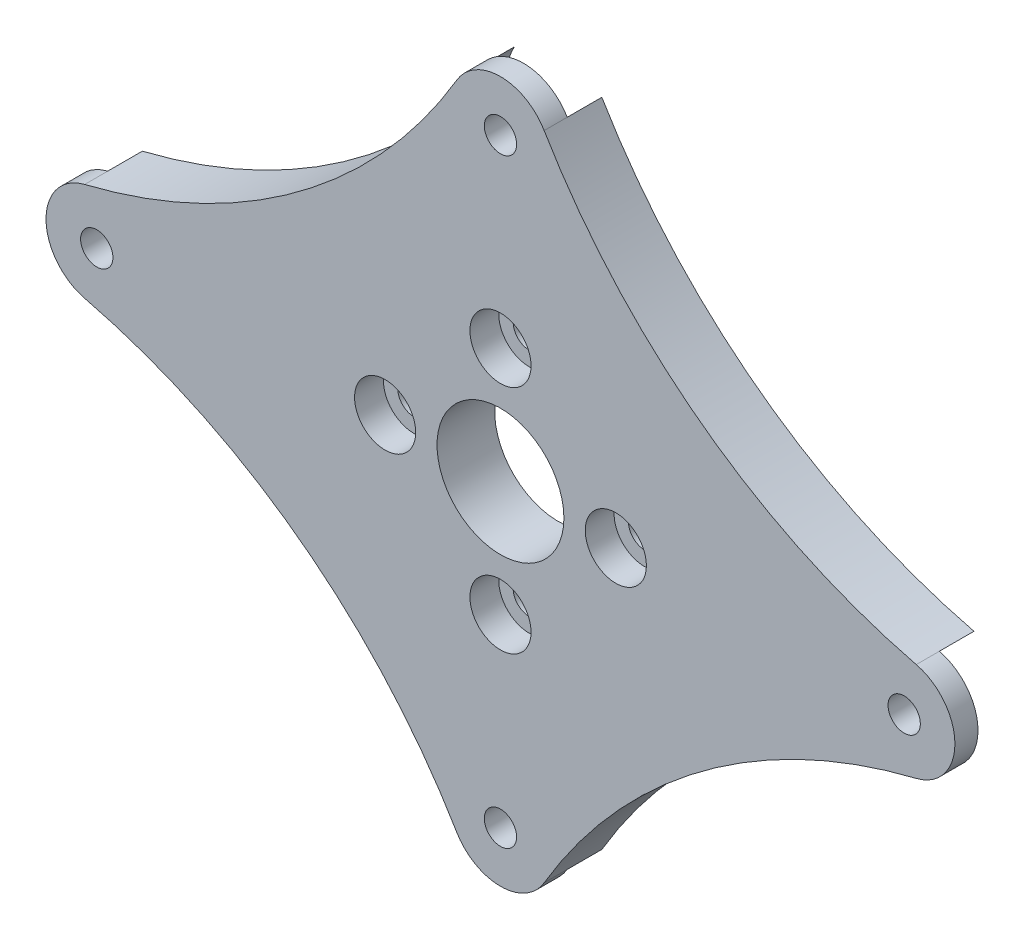
ISO-10303-21;
HEADER;
FILE_DESCRIPTION(('STEP AP214'),'2;1');
FILE_NAME('part.step','',(''),(''),'','','');
FILE_SCHEMA(('AUTOMOTIVE_DESIGN { 1 0 10303 214 1 1 1 1 }'));
ENDSEC;
DATA;
#1=APPLICATION_CONTEXT('core data for automotive mechanical design processes');
#2=APPLICATION_PROTOCOL_DEFINITION('international standard','automotive_design',2000,#1);
#3=PRODUCT_CONTEXT('',#1,'mechanical');
#4=PRODUCT('Part','Part','',(#3));
#5=PRODUCT_RELATED_PRODUCT_CATEGORY('part','',(#4));
#6=PRODUCT_DEFINITION_FORMATION('','',#4);
#7=PRODUCT_DEFINITION_CONTEXT('part definition',#1,'design');
#8=PRODUCT_DEFINITION('design','',#6,#7);
#9=PRODUCT_DEFINITION_SHAPE('','',#8);
#10=(LENGTH_UNIT() NAMED_UNIT(*) SI_UNIT(.MILLI.,.METRE.));
#11=(NAMED_UNIT(*) PLANE_ANGLE_UNIT() SI_UNIT($,.RADIAN.));
#12=(NAMED_UNIT(*) SI_UNIT($,.STERADIAN.) SOLID_ANGLE_UNIT());
#13=UNCERTAINTY_MEASURE_WITH_UNIT(LENGTH_MEASURE(1.E-05),#10,'distance_accuracy_value','');
#14=(GEOMETRIC_REPRESENTATION_CONTEXT(3) GLOBAL_UNCERTAINTY_ASSIGNED_CONTEXT((#13)) GLOBAL_UNIT_ASSIGNED_CONTEXT((#10,
#11,#12)) REPRESENTATION_CONTEXT('',''));
#15=CARTESIAN_POINT('',(0.,0.,0.));
#16=DIRECTION('',(0.,0.,1.));
#17=DIRECTION('',(1.,0.,0.));
#18=AXIS2_PLACEMENT_3D('',#15,#16,#17);
#19=CARTESIAN_POINT('',(-35.,0.,5.));
#20=DIRECTION('',(0.,0.,-1.));
#21=DIRECTION('',(-1.,0.,0.));
#22=AXIS2_PLACEMENT_3D('',#19,#20,#21);
#23=CYLINDRICAL_SURFACE('',#22,4.4);
#24=CARTESIAN_POINT('',(-35.,0.,3.));
#25=DIRECTION('',(0.,0.,-1.));
#26=DIRECTION('',(-1.,0.,0.));
#27=AXIS2_PLACEMENT_3D('',#24,#25,#26);
#28=CIRCLE('',#27,4.4);
#29=CARTESIAN_POINT('',(-36.0484540455452,-4.27325919110694,3.));
#30=VERTEX_POINT('',#29);
#31=CARTESIAN_POINT('',(-36.0484540455452,4.27325919110695,3.));
#32=VERTEX_POINT('',#31);
#33=EDGE_CURVE('E396',#30,#32,#28,.T.);
#34=ORIENTED_EDGE('',*,*,#33,.F.);
#35=DIRECTION('',(0.,0.,-1.));
#36=VECTOR('',#35,1.);
#37=CARTESIAN_POINT('',(-36.0484540455452,-4.27325919110694,5.));
#38=LINE('',#37,#36);
#39=CARTESIAN_POINT('',(-36.0484540455452,-4.27325919110694,5.));
#40=VERTEX_POINT('',#39);
#41=EDGE_CURVE('E55',#40,#30,#38,.T.);
#42=ORIENTED_EDGE('',*,*,#41,.F.);
#43=CARTESIAN_POINT('',(-35.,0.,5.));
#44=DIRECTION('',(0.,0.,1.));
#45=DIRECTION('',(-1.,0.,0.));
#46=AXIS2_PLACEMENT_3D('',#43,#44,#45);
#47=CIRCLE('',#46,4.4);
#48=CARTESIAN_POINT('',(-36.0484540455452,4.27325919110694,5.));
#49=VERTEX_POINT('',#48);
#50=EDGE_CURVE('E98',#49,#40,#47,.T.);
#51=ORIENTED_EDGE('',*,*,#50,.F.);
#52=DIRECTION('',(0.,0.,-1.));
#53=VECTOR('',#52,1.);
#54=CARTESIAN_POINT('',(-36.0484540455452,4.27325919110694,5.));
#55=LINE('',#54,#53);
#56=EDGE_CURVE('E11',#49,#32,#55,.T.);
#57=ORIENTED_EDGE('',*,*,#56,.T.);
#58=EDGE_LOOP('',(#34,#42,#51,#57));
#59=FACE_BOUND('',#58,.T.);
#60=ADVANCED_FACE('F45',(#59),#23,.T.);
#61=CARTESIAN_POINT('',(0.,-26.,5.));
#62=DIRECTION('',(0.,0.,-1.));
#63=DIRECTION('',(-1.,0.,0.));
#64=AXIS2_PLACEMENT_3D('',#61,#62,#63);
#65=CYLINDRICAL_SURFACE('',#64,4.4);
#66=CARTESIAN_POINT('',(0.,-26.,3.));
#67=DIRECTION('',(0.,0.,-1.));
#68=DIRECTION('',(-1.,0.,0.));
#69=AXIS2_PLACEMENT_3D('',#66,#67,#68);
#70=CIRCLE('',#69,4.4);
#71=CARTESIAN_POINT('',(3.78839056118376,-28.2378777794897,3.));
#72=VERTEX_POINT('',#71);
#73=CARTESIAN_POINT('',(-3.78839056118376,-28.2378777794897,3.));
#74=VERTEX_POINT('',#73);
#75=EDGE_CURVE('E330',#72,#74,#70,.T.);
#76=ORIENTED_EDGE('',*,*,#75,.F.);
#77=DIRECTION('',(0.,0.,-1.));
#78=VECTOR('',#77,1.);
#79=CARTESIAN_POINT('',(3.78839056118375,-28.2378777794897,5.));
#80=LINE('',#79,#78);
#81=CARTESIAN_POINT('',(3.78839056118375,-28.2378777794897,5.));
#82=VERTEX_POINT('',#81);
#83=EDGE_CURVE('E178',#82,#72,#80,.T.);
#84=ORIENTED_EDGE('',*,*,#83,.F.);
#85=CARTESIAN_POINT('',(0.,-26.,5.));
#86=DIRECTION('',(0.,0.,1.));
#87=DIRECTION('',(-1.,0.,0.));
#88=AXIS2_PLACEMENT_3D('',#85,#86,#87);
#89=CIRCLE('',#88,4.4);
#90=CARTESIAN_POINT('',(-3.78839056118377,-28.2378777794897,5.));
#91=VERTEX_POINT('',#90);
#92=EDGE_CURVE('E318',#91,#82,#89,.T.);
#93=ORIENTED_EDGE('',*,*,#92,.F.);
#94=DIRECTION('',(0.,0.,-1.));
#95=VECTOR('',#94,1.);
#96=CARTESIAN_POINT('',(-3.78839056118377,-28.2378777794897,5.));
#97=LINE('',#96,#95);
#98=EDGE_CURVE('E182',#91,#74,#97,.T.);
#99=ORIENTED_EDGE('',*,*,#98,.T.);
#100=EDGE_LOOP('',(#76,#84,#93,#99));
#101=FACE_BOUND('',#100,.T.);
#102=ADVANCED_FACE('F327',(#101),#65,.T.);
#103=CARTESIAN_POINT('',(35.,0.,5.));
#104=DIRECTION('',(0.,0.,-1.));
#105=DIRECTION('',(-1.,0.,0.));
#106=AXIS2_PLACEMENT_3D('',#103,#104,#105);
#107=CYLINDRICAL_SURFACE('',#106,4.4);
#108=CARTESIAN_POINT('',(35.,0.,3.));
#109=DIRECTION('',(0.,0.,-1.));
#110=DIRECTION('',(-1.,0.,0.));
#111=AXIS2_PLACEMENT_3D('',#108,#109,#110);
#112=CIRCLE('',#111,4.4);
#113=CARTESIAN_POINT('',(36.0484540455452,4.27325919110694,3.));
#114=VERTEX_POINT('',#113);
#115=CARTESIAN_POINT('',(36.0484540455452,-4.27325919110694,3.));
#116=VERTEX_POINT('',#115);
#117=EDGE_CURVE('E133',#114,#116,#112,.T.);
#118=ORIENTED_EDGE('',*,*,#117,.F.);
#119=DIRECTION('',(0.,0.,-1.));
#120=VECTOR('',#119,1.);
#121=CARTESIAN_POINT('',(36.0484540455452,4.27325919110693,5.));
#122=LINE('',#121,#120);
#123=CARTESIAN_POINT('',(36.0484540455452,4.27325919110693,5.));
#124=VERTEX_POINT('',#123);
#125=EDGE_CURVE('E129',#124,#114,#122,.T.);
#126=ORIENTED_EDGE('',*,*,#125,.F.);
#127=CARTESIAN_POINT('',(35.,0.,5.));
#128=DIRECTION('',(0.,0.,1.));
#129=DIRECTION('',(-1.,0.,0.));
#130=AXIS2_PLACEMENT_3D('',#127,#128,#129);
#131=CIRCLE('',#130,4.4);
#132=CARTESIAN_POINT('',(36.0484540455452,-4.27325919110694,5.));
#133=VERTEX_POINT('',#132);
#134=EDGE_CURVE('E113',#133,#124,#131,.T.);
#135=ORIENTED_EDGE('',*,*,#134,.F.);
#136=DIRECTION('',(0.,0.,-1.));
#137=VECTOR('',#136,1.);
#138=CARTESIAN_POINT('',(36.0484540455452,-4.27325919110694,5.));
#139=LINE('',#138,#137);
#140=EDGE_CURVE('E136',#133,#116,#139,.T.);
#141=ORIENTED_EDGE('',*,*,#140,.T.);
#142=EDGE_LOOP('',(#118,#126,#135,#141));
#143=FACE_BOUND('',#142,.T.);
#144=ADVANCED_FACE('F130',(#143),#107,.T.);
#145=CARTESIAN_POINT('',(0.,26.,5.));
#146=DIRECTION('',(0.,0.,-1.));
#147=DIRECTION('',(-1.,0.,0.));
#148=AXIS2_PLACEMENT_3D('',#145,#146,#147);
#149=CYLINDRICAL_SURFACE('',#148,4.4);
#150=CARTESIAN_POINT('',(0.,26.,3.));
#151=DIRECTION('',(0.,0.,-1.));
#152=DIRECTION('',(-1.,0.,0.));
#153=AXIS2_PLACEMENT_3D('',#150,#151,#152);
#154=CIRCLE('',#153,4.4);
#155=CARTESIAN_POINT('',(-3.78839056118376,28.2378777794897,3.));
#156=VERTEX_POINT('',#155);
#157=CARTESIAN_POINT('',(3.78839056118376,28.2378777794897,3.));
#158=VERTEX_POINT('',#157);
#159=EDGE_CURVE('E213',#156,#158,#154,.T.);
#160=ORIENTED_EDGE('',*,*,#159,.F.);
#161=DIRECTION('',(0.,0.,-1.));
#162=VECTOR('',#161,1.);
#163=CARTESIAN_POINT('',(-3.78839056118376,28.2378777794897,5.));
#164=LINE('',#163,#162);
#165=CARTESIAN_POINT('',(-3.78839056118376,28.2378777794897,5.));
#166=VERTEX_POINT('',#165);
#167=EDGE_CURVE('E168',#166,#156,#164,.T.);
#168=ORIENTED_EDGE('',*,*,#167,.F.);
#169=CARTESIAN_POINT('',(0.,26.,5.));
#170=DIRECTION('',(0.,0.,1.));
#171=DIRECTION('',(-1.,0.,0.));
#172=AXIS2_PLACEMENT_3D('',#169,#170,#171);
#173=CIRCLE('',#172,4.4);
#174=CARTESIAN_POINT('',(3.78839056118376,28.2378777794897,5.));
#175=VERTEX_POINT('',#174);
#176=EDGE_CURVE('E71',#175,#166,#173,.T.);
#177=ORIENTED_EDGE('',*,*,#176,.F.);
#178=DIRECTION('',(0.,0.,-1.));
#179=VECTOR('',#178,1.);
#180=CARTESIAN_POINT('',(3.78839056118376,28.2378777794897,5.));
#181=LINE('',#180,#179);
#182=EDGE_CURVE('E143',#175,#158,#181,.T.);
#183=ORIENTED_EDGE('',*,*,#182,.T.);
#184=EDGE_LOOP('',(#160,#168,#177,#183));
#185=FACE_BOUND('',#184,.T.);
#186=ADVANCED_FACE('F437',(#185),#149,.T.);
#187=CARTESIAN_POINT('',(35.,0.,5.));
#188=DIRECTION('',(0.,0.,-1.));
#189=DIRECTION('',(-1.,0.,0.));
#190=AXIS2_PLACEMENT_3D('',#187,#188,#189);
#191=CYLINDRICAL_SURFACE('',#190,1.4);
#192=CARTESIAN_POINT('',(35.,0.,5.));
#193=DIRECTION('',(0.,0.,1.));
#194=DIRECTION('',(1.,0.,0.));
#195=AXIS2_PLACEMENT_3D('',#192,#193,#194);
#196=CIRCLE('',#195,1.4);
#197=CARTESIAN_POINT('',(36.4,0.,5.));
#198=VERTEX_POINT('',#197);
#199=EDGE_CURVE('E284',#198,#198,#196,.T.);
#200=ORIENTED_EDGE('',*,*,#199,.T.);
#201=EDGE_LOOP('',(#200));
#202=FACE_BOUND('',#201,.T.);
#203=CARTESIAN_POINT('',(35.,0.,3.));
#204=DIRECTION('',(0.,0.,-1.));
#205=DIRECTION('',(-1.,0.,0.));
#206=AXIS2_PLACEMENT_3D('',#203,#204,#205);
#207=CIRCLE('',#206,1.4);
#208=CARTESIAN_POINT('',(33.6,0.,3.));
#209=VERTEX_POINT('',#208);
#210=EDGE_CURVE('E49',#209,#209,#207,.T.);
#211=ORIENTED_EDGE('',*,*,#210,.T.);
#212=EDGE_LOOP('',(#211));
#213=FACE_BOUND('',#212,.T.);
#214=ADVANCED_FACE('F443',(#202,#213),#191,.F.);
#215=CARTESIAN_POINT('',(0.,26.,5.));
#216=DIRECTION('',(0.,0.,-1.));
#217=DIRECTION('',(-1.,0.,0.));
#218=AXIS2_PLACEMENT_3D('',#215,#216,#217);
#219=CYLINDRICAL_SURFACE('',#218,1.4);
#220=CARTESIAN_POINT('',(0.,26.,5.));
#221=DIRECTION('',(0.,0.,1.));
#222=DIRECTION('',(1.,0.,0.));
#223=AXIS2_PLACEMENT_3D('',#220,#221,#222);
#224=CIRCLE('',#223,1.4);
#225=CARTESIAN_POINT('',(1.4,26.,5.));
#226=VERTEX_POINT('',#225);
#227=EDGE_CURVE('E280',#226,#226,#224,.T.);
#228=ORIENTED_EDGE('',*,*,#227,.T.);
#229=EDGE_LOOP('',(#228));
#230=FACE_BOUND('',#229,.T.);
#231=CARTESIAN_POINT('',(0.,26.,3.));
#232=DIRECTION('',(0.,0.,-1.));
#233=DIRECTION('',(-1.,0.,0.));
#234=AXIS2_PLACEMENT_3D('',#231,#232,#233);
#235=CIRCLE('',#234,1.4);
#236=CARTESIAN_POINT('',(-1.4,26.,3.));
#237=VERTEX_POINT('',#236);
#238=EDGE_CURVE('E216',#237,#237,#235,.T.);
#239=ORIENTED_EDGE('',*,*,#238,.T.);
#240=EDGE_LOOP('',(#239));
#241=FACE_BOUND('',#240,.T.);
#242=ADVANCED_FACE('F473',(#230,#241),#219,.F.);
#243=CARTESIAN_POINT('',(0.,-26.,5.));
#244=DIRECTION('',(0.,0.,-1.));
#245=DIRECTION('',(-1.,0.,0.));
#246=AXIS2_PLACEMENT_3D('',#243,#244,#245);
#247=CYLINDRICAL_SURFACE('',#246,1.4);
#248=CARTESIAN_POINT('',(0.,-26.,5.));
#249=DIRECTION('',(0.,0.,1.));
#250=DIRECTION('',(1.,0.,0.));
#251=AXIS2_PLACEMENT_3D('',#248,#249,#250);
#252=CIRCLE('',#251,1.4);
#253=CARTESIAN_POINT('',(1.4,-26.,5.));
#254=VERTEX_POINT('',#253);
#255=EDGE_CURVE('E276',#254,#254,#252,.T.);
#256=ORIENTED_EDGE('',*,*,#255,.T.);
#257=EDGE_LOOP('',(#256));
#258=FACE_BOUND('',#257,.T.);
#259=CARTESIAN_POINT('',(0.,-26.,3.));
#260=DIRECTION('',(0.,0.,-1.));
#261=DIRECTION('',(-1.,0.,0.));
#262=AXIS2_PLACEMENT_3D('',#259,#260,#261);
#263=CIRCLE('',#262,1.4);
#264=CARTESIAN_POINT('',(-1.4,-26.,3.));
#265=VERTEX_POINT('',#264);
#266=EDGE_CURVE('E212',#265,#265,#263,.T.);
#267=ORIENTED_EDGE('',*,*,#266,.T.);
#268=EDGE_LOOP('',(#267));
#269=FACE_BOUND('',#268,.T.);
#270=ADVANCED_FACE('F477',(#258,#269),#247,.F.);
#271=CARTESIAN_POINT('',(-35.,0.,5.));
#272=DIRECTION('',(0.,0.,-1.));
#273=DIRECTION('',(-1.,0.,0.));
#274=AXIS2_PLACEMENT_3D('',#271,#272,#273);
#275=CYLINDRICAL_SURFACE('',#274,1.4);
#276=CARTESIAN_POINT('',(-35.,0.,5.));
#277=DIRECTION('',(0.,0.,1.));
#278=DIRECTION('',(1.,0.,0.));
#279=AXIS2_PLACEMENT_3D('',#276,#277,#278);
#280=CIRCLE('',#279,1.4);
#281=CARTESIAN_POINT('',(-33.6,0.,5.));
#282=VERTEX_POINT('',#281);
#283=EDGE_CURVE('E207',#282,#282,#280,.T.);
#284=ORIENTED_EDGE('',*,*,#283,.T.);
#285=EDGE_LOOP('',(#284));
#286=FACE_BOUND('',#285,.T.);
#287=CARTESIAN_POINT('',(-35.,0.,3.));
#288=DIRECTION('',(0.,0.,-1.));
#289=DIRECTION('',(-1.,0.,0.));
#290=AXIS2_PLACEMENT_3D('',#287,#288,#289);
#291=CIRCLE('',#290,1.4);
#292=CARTESIAN_POINT('',(-36.4,0.,3.));
#293=VERTEX_POINT('',#292);
#294=EDGE_CURVE('E208',#293,#293,#291,.T.);
#295=ORIENTED_EDGE('',*,*,#294,.T.);
#296=EDGE_LOOP('',(#295));
#297=FACE_BOUND('',#296,.T.);
#298=ADVANCED_FACE('F459',(#286,#297),#275,.F.);
#299=CARTESIAN_POINT('',(0.,10.,5.));
#300=DIRECTION('',(0.,0.,-1.));
#301=DIRECTION('',(-1.,0.,0.));
#302=AXIS2_PLACEMENT_3D('',#299,#300,#301);
#303=CYLINDRICAL_SURFACE('',#302,1.4);
#304=CARTESIAN_POINT('',(0.,10.,0.));
#305=DIRECTION('',(0.,0.,1.));
#306=DIRECTION('',(1.,0.,0.));
#307=AXIS2_PLACEMENT_3D('',#304,#305,#306);
#308=CIRCLE('',#307,1.4);
#309=CARTESIAN_POINT('',(1.4,10.,0.));
#310=VERTEX_POINT('',#309);
#311=EDGE_CURVE('E300',#310,#310,#308,.T.);
#312=ORIENTED_EDGE('',*,*,#311,.F.);
#313=EDGE_LOOP('',(#312));
#314=FACE_BOUND('',#313,.T.);
#315=CARTESIAN_POINT('',(0.,10.,2.5));
#316=DIRECTION('',(0.,0.,1.));
#317=DIRECTION('',(1.,0.,0.));
#318=AXIS2_PLACEMENT_3D('',#315,#316,#317);
#319=CIRCLE('',#318,1.4);
#320=CARTESIAN_POINT('',(1.4,10.,2.5));
#321=VERTEX_POINT('',#320);
#322=EDGE_CURVE('E203',#321,#321,#319,.T.);
#323=ORIENTED_EDGE('',*,*,#322,.T.);
#324=EDGE_LOOP('',(#323));
#325=FACE_BOUND('',#324,.T.);
#326=ADVANCED_FACE('F455',(#314,#325),#303,.F.);
#327=CARTESIAN_POINT('',(10.,0.,5.));
#328=DIRECTION('',(0.,0.,-1.));
#329=DIRECTION('',(-1.,0.,0.));
#330=AXIS2_PLACEMENT_3D('',#327,#328,#329);
#331=CYLINDRICAL_SURFACE('',#330,1.4);
#332=CARTESIAN_POINT('',(10.,0.,0.));
#333=DIRECTION('',(0.,0.,1.));
#334=DIRECTION('',(1.,0.,0.));
#335=AXIS2_PLACEMENT_3D('',#332,#333,#334);
#336=CIRCLE('',#335,1.4);
#337=CARTESIAN_POINT('',(11.4,0.,0.));
#338=VERTEX_POINT('',#337);
#339=EDGE_CURVE('E296',#338,#338,#336,.T.);
#340=ORIENTED_EDGE('',*,*,#339,.F.);
#341=EDGE_LOOP('',(#340));
#342=FACE_BOUND('',#341,.T.);
#343=CARTESIAN_POINT('',(10.,0.,2.5));
#344=DIRECTION('',(0.,0.,1.));
#345=DIRECTION('',(1.,0.,0.));
#346=AXIS2_PLACEMENT_3D('',#343,#344,#345);
#347=CIRCLE('',#346,1.4);
#348=CARTESIAN_POINT('',(11.4,0.,2.5));
#349=VERTEX_POINT('',#348);
#350=EDGE_CURVE('E199',#349,#349,#347,.T.);
#351=ORIENTED_EDGE('',*,*,#350,.T.);
#352=EDGE_LOOP('',(#351));
#353=FACE_BOUND('',#352,.T.);
#354=ADVANCED_FACE('F458',(#342,#353),#331,.F.);
#355=CARTESIAN_POINT('',(0.,-10.,5.));
#356=DIRECTION('',(0.,0.,-1.));
#357=DIRECTION('',(-1.,0.,0.));
#358=AXIS2_PLACEMENT_3D('',#355,#356,#357);
#359=CYLINDRICAL_SURFACE('',#358,1.4);
#360=CARTESIAN_POINT('',(0.,-10.,0.));
#361=DIRECTION('',(0.,0.,1.));
#362=DIRECTION('',(1.,0.,0.));
#363=AXIS2_PLACEMENT_3D('',#360,#361,#362);
#364=CIRCLE('',#363,1.4);
#365=CARTESIAN_POINT('',(1.4,-10.,0.));
#366=VERTEX_POINT('',#365);
#367=EDGE_CURVE('E292',#366,#366,#364,.T.);
#368=ORIENTED_EDGE('',*,*,#367,.F.);
#369=EDGE_LOOP('',(#368));
#370=FACE_BOUND('',#369,.T.);
#371=CARTESIAN_POINT('',(0.,-10.,2.5));
#372=DIRECTION('',(0.,0.,1.));
#373=DIRECTION('',(1.,0.,0.));
#374=AXIS2_PLACEMENT_3D('',#371,#372,#373);
#375=CIRCLE('',#374,1.4);
#376=CARTESIAN_POINT('',(1.4,-10.,2.5));
#377=VERTEX_POINT('',#376);
#378=EDGE_CURVE('E194',#377,#377,#375,.T.);
#379=ORIENTED_EDGE('',*,*,#378,.T.);
#380=EDGE_LOOP('',(#379));
#381=FACE_BOUND('',#380,.T.);
#382=ADVANCED_FACE('F463',(#370,#381),#359,.F.);
#383=CARTESIAN_POINT('',(-10.,0.,5.));
#384=DIRECTION('',(0.,0.,-1.));
#385=DIRECTION('',(-1.,0.,0.));
#386=AXIS2_PLACEMENT_3D('',#383,#384,#385);
#387=CYLINDRICAL_SURFACE('',#386,1.4);
#388=CARTESIAN_POINT('',(-10.,0.,0.));
#389=DIRECTION('',(0.,0.,1.));
#390=DIRECTION('',(1.,0.,0.));
#391=AXIS2_PLACEMENT_3D('',#388,#389,#390);
#392=CIRCLE('',#391,1.4);
#393=CARTESIAN_POINT('',(-8.6,0.,0.));
#394=VERTEX_POINT('',#393);
#395=EDGE_CURVE('E288',#394,#394,#392,.T.);
#396=ORIENTED_EDGE('',*,*,#395,.F.);
#397=EDGE_LOOP('',(#396));
#398=FACE_BOUND('',#397,.T.);
#399=CARTESIAN_POINT('',(-10.,0.,2.5));
#400=DIRECTION('',(0.,0.,1.));
#401=DIRECTION('',(1.,0.,0.));
#402=AXIS2_PLACEMENT_3D('',#399,#400,#401);
#403=CIRCLE('',#402,1.4);
#404=CARTESIAN_POINT('',(-8.6,0.,2.5));
#405=VERTEX_POINT('',#404);
#406=EDGE_CURVE('E190',#405,#405,#403,.T.);
#407=ORIENTED_EDGE('',*,*,#406,.T.);
#408=EDGE_LOOP('',(#407));
#409=FACE_BOUND('',#408,.T.);
#410=ADVANCED_FACE('F449',(#398,#409),#387,.F.);
#411=CARTESIAN_POINT('',(-41.6964857369202,27.2933461843157,5.));
#412=DIRECTION('',(0.,0.,-1.));
#413=DIRECTION('',(-1.,0.,0.));
#414=AXIS2_PLACEMENT_3D('',#411,#412,#413);
#415=PLANE('',#414);
#416=CARTESIAN_POINT('',(0.,10.,5.));
#417=DIRECTION('',(0.,0.,1.));
#418=DIRECTION('',(1.,0.,0.));
#419=AXIS2_PLACEMENT_3D('',#416,#417,#418);
#420=CIRCLE('',#419,2.65);
#421=CARTESIAN_POINT('',(2.65,10.,5.));
#422=VERTEX_POINT('',#421);
#423=EDGE_CURVE('E246',#422,#422,#420,.T.);
#424=ORIENTED_EDGE('',*,*,#423,.F.);
#425=EDGE_LOOP('',(#424));
#426=FACE_BOUND('',#425,.T.);
#427=CARTESIAN_POINT('',(10.,0.,5.));
#428=DIRECTION('',(0.,0.,1.));
#429=DIRECTION('',(1.,0.,0.));
#430=AXIS2_PLACEMENT_3D('',#427,#428,#429);
#431=CIRCLE('',#430,2.65);
#432=CARTESIAN_POINT('',(12.65,0.,5.));
#433=VERTEX_POINT('',#432);
#434=EDGE_CURVE('E250',#433,#433,#431,.T.);
#435=ORIENTED_EDGE('',*,*,#434,.F.);
#436=EDGE_LOOP('',(#435));
#437=FACE_BOUND('',#436,.T.);
#438=CARTESIAN_POINT('',(0.,-10.,5.));
#439=DIRECTION('',(0.,0.,1.));
#440=DIRECTION('',(1.,0.,0.));
#441=AXIS2_PLACEMENT_3D('',#438,#439,#440);
#442=CIRCLE('',#441,2.65);
#443=CARTESIAN_POINT('',(2.65,-10.,5.));
#444=VERTEX_POINT('',#443);
#445=EDGE_CURVE('E258',#444,#444,#442,.T.);
#446=ORIENTED_EDGE('',*,*,#445,.F.);
#447=EDGE_LOOP('',(#446));
#448=FACE_BOUND('',#447,.T.);
#449=CARTESIAN_POINT('',(-10.,0.,5.));
#450=DIRECTION('',(0.,0.,1.));
#451=DIRECTION('',(1.,0.,0.));
#452=AXIS2_PLACEMENT_3D('',#449,#450,#451);
#453=CIRCLE('',#452,2.65);
#454=CARTESIAN_POINT('',(-7.35,0.,5.));
#455=VERTEX_POINT('',#454);
#456=EDGE_CURVE('E266',#455,#455,#453,.T.);
#457=ORIENTED_EDGE('',*,*,#456,.F.);
#458=EDGE_LOOP('',(#457));
#459=FACE_BOUND('',#458,.T.);
#460=CARTESIAN_POINT('',(-48.3929714738404,54.5866923686313,5.));
#461=DIRECTION('',(0.,0.,-1.));
#462=DIRECTION('',(-1.,0.,0.));
#463=AXIS2_PLACEMENT_3D('',#460,#461,#462);
#464=CIRCLE('',#463,51.8056818181818);
#465=EDGE_CURVE('E167',#166,#49,#464,.T.);
#466=ORIENTED_EDGE('',*,*,#465,.T.);
#467=ORIENTED_EDGE('',*,*,#50,.T.);
#468=CARTESIAN_POINT('',(-48.3929714738404,-54.5866923686313,5.));
#469=DIRECTION('',(0.,0.,-1.));
#470=DIRECTION('',(1.,0.,0.));
#471=AXIS2_PLACEMENT_3D('',#468,#469,#470);
#472=CIRCLE('',#471,51.8056818181818);
#473=EDGE_CURVE('E315',#40,#91,#472,.T.);
#474=ORIENTED_EDGE('',*,*,#473,.T.);
#475=ORIENTED_EDGE('',*,*,#92,.T.);
#476=CARTESIAN_POINT('',(48.3929714738404,-54.5866923686313,5.));
#477=DIRECTION('',(0.,0.,-1.));
#478=DIRECTION('',(-1.,0.,0.));
#479=AXIS2_PLACEMENT_3D('',#476,#477,#478);
#480=CIRCLE('',#479,51.8056818181818);
#481=EDGE_CURVE('E121',#82,#133,#480,.T.);
#482=ORIENTED_EDGE('',*,*,#481,.T.);
#483=ORIENTED_EDGE('',*,*,#134,.T.);
#484=CARTESIAN_POINT('',(48.3929714738404,54.5866923686313,5.));
#485=DIRECTION('',(0.,0.,-1.));
#486=DIRECTION('',(1.,0.,0.));
#487=AXIS2_PLACEMENT_3D('',#484,#485,#486);
#488=CIRCLE('',#487,51.8056818181818);
#489=EDGE_CURVE('E118',#124,#175,#488,.T.);
#490=ORIENTED_EDGE('',*,*,#489,.T.);
#491=ORIENTED_EDGE('',*,*,#176,.T.);
#492=EDGE_LOOP('',(#466,#467,#474,#475,#482,#483,#490,#491));
#493=FACE_BOUND('',#492,.T.);
#494=CARTESIAN_POINT('',(0.,0.,5.));
#495=DIRECTION('',(0.,0.,1.));
#496=DIRECTION('',(1.,0.,0.));
#497=AXIS2_PLACEMENT_3D('',#494,#495,#496);
#498=CIRCLE('',#497,5.5);
#499=CARTESIAN_POINT('',(5.5,0.,5.));
#500=VERTEX_POINT('',#499);
#501=EDGE_CURVE('E156',#500,#500,#498,.T.);
#502=ORIENTED_EDGE('',*,*,#501,.F.);
#503=EDGE_LOOP('',(#502));
#504=FACE_BOUND('',#503,.T.);
#505=ORIENTED_EDGE('',*,*,#199,.F.);
#506=EDGE_LOOP('',(#505));
#507=FACE_BOUND('',#506,.T.);
#508=ORIENTED_EDGE('',*,*,#227,.F.);
#509=EDGE_LOOP('',(#508));
#510=FACE_BOUND('',#509,.T.);
#511=ORIENTED_EDGE('',*,*,#255,.F.);
#512=EDGE_LOOP('',(#511));
#513=FACE_BOUND('',#512,.T.);
#514=ORIENTED_EDGE('',*,*,#283,.F.);
#515=EDGE_LOOP('',(#514));
#516=FACE_BOUND('',#515,.T.);
#517=ADVANCED_FACE('F115',(#426,#437,#448,#459,#493,#504,#507,#510,#513,#516),#415,.F.);
#518=CARTESIAN_POINT('',(-41.6964857369202,27.2933461843157,0.));
#519=DIRECTION('',(0.,0.,-1.));
#520=DIRECTION('',(-1.,0.,0.));
#521=AXIS2_PLACEMENT_3D('',#518,#519,#520);
#522=PLANE('',#521);
#523=CARTESIAN_POINT('',(0.,26.,0.));
#524=DIRECTION('',(0.,0.,-1.));
#525=DIRECTION('',(-1.,0.,0.));
#526=AXIS2_PLACEMENT_3D('',#523,#524,#525);
#527=CIRCLE('',#526,4.4);
#528=CARTESIAN_POINT('',(3.78839056118376,28.2378777794897,0.));
#529=VERTEX_POINT('',#528);
#530=CARTESIAN_POINT('',(-3.78839056118376,28.2378777794897,0.));
#531=VERTEX_POINT('',#530);
#532=EDGE_CURVE('E379',#529,#531,#527,.T.);
#533=ORIENTED_EDGE('',*,*,#532,.F.);
#534=CARTESIAN_POINT('',(48.3929714738404,54.5866923686313,0.));
#535=DIRECTION('',(0.,0.,-1.));
#536=DIRECTION('',(1.,0.,0.));
#537=AXIS2_PLACEMENT_3D('',#534,#535,#536);
#538=CIRCLE('',#537,51.8056818181818);
#539=CARTESIAN_POINT('',(36.0484540455452,4.27325919110693,0.));
#540=VERTEX_POINT('',#539);
#541=EDGE_CURVE('E164',#540,#529,#538,.T.);
#542=ORIENTED_EDGE('',*,*,#541,.F.);
#543=CARTESIAN_POINT('',(35.,0.,0.));
#544=DIRECTION('',(0.,0.,-1.));
#545=DIRECTION('',(-1.,0.,0.));
#546=AXIS2_PLACEMENT_3D('',#543,#544,#545);
#547=CIRCLE('',#546,4.4);
#548=CARTESIAN_POINT('',(36.0484540455452,-4.27325919110694,0.));
#549=VERTEX_POINT('',#548);
#550=EDGE_CURVE('E90',#549,#540,#547,.T.);
#551=ORIENTED_EDGE('',*,*,#550,.F.);
#552=CARTESIAN_POINT('',(48.3929714738404,-54.5866923686313,0.));
#553=DIRECTION('',(0.,0.,-1.));
#554=DIRECTION('',(-1.,0.,0.));
#555=AXIS2_PLACEMENT_3D('',#552,#553,#554);
#556=CIRCLE('',#555,51.8056818181818);
#557=CARTESIAN_POINT('',(3.78839056118375,-28.2378777794897,0.));
#558=VERTEX_POINT('',#557);
#559=EDGE_CURVE('E160',#558,#549,#556,.T.);
#560=ORIENTED_EDGE('',*,*,#559,.F.);
#561=CARTESIAN_POINT('',(0.,-26.,0.));
#562=DIRECTION('',(0.,0.,-1.));
#563=DIRECTION('',(-1.,0.,0.));
#564=AXIS2_PLACEMENT_3D('',#561,#562,#563);
#565=CIRCLE('',#564,4.4);
#566=CARTESIAN_POINT('',(-3.78839056118376,-28.2378777794897,0.));
#567=VERTEX_POINT('',#566);
#568=EDGE_CURVE('E400',#567,#558,#565,.T.);
#569=ORIENTED_EDGE('',*,*,#568,.F.);
#570=CARTESIAN_POINT('',(-48.3929714738404,-54.5866923686313,0.));
#571=DIRECTION('',(0.,0.,-1.));
#572=DIRECTION('',(1.,0.,0.));
#573=AXIS2_PLACEMENT_3D('',#570,#571,#572);
#574=CIRCLE('',#573,51.8056818181818);
#575=CARTESIAN_POINT('',(-36.0484540455452,-4.27325919110694,0.));
#576=VERTEX_POINT('',#575);
#577=EDGE_CURVE('E155',#576,#567,#574,.T.);
#578=ORIENTED_EDGE('',*,*,#577,.F.);
#579=CARTESIAN_POINT('',(-35.,0.,0.));
#580=DIRECTION('',(0.,0.,-1.));
#581=DIRECTION('',(-1.,0.,0.));
#582=AXIS2_PLACEMENT_3D('',#579,#580,#581);
#583=CIRCLE('',#582,4.4);
#584=CARTESIAN_POINT('',(-36.0484540455452,4.27325919110695,0.));
#585=VERTEX_POINT('',#584);
#586=EDGE_CURVE('E365',#585,#576,#583,.T.);
#587=ORIENTED_EDGE('',*,*,#586,.F.);
#588=CARTESIAN_POINT('',(-48.3929714738404,54.5866923686313,0.));
#589=DIRECTION('',(0.,0.,-1.));
#590=DIRECTION('',(-1.,0.,0.));
#591=AXIS2_PLACEMENT_3D('',#588,#589,#590);
#592=CIRCLE('',#591,51.8056818181818);
#593=EDGE_CURVE('E151',#531,#585,#592,.T.);
#594=ORIENTED_EDGE('',*,*,#593,.F.);
#595=EDGE_LOOP('',(#533,#542,#551,#560,#569,#578,#587,#594));
#596=FACE_BOUND('',#595,.T.);
#597=ORIENTED_EDGE('',*,*,#367,.T.);
#598=EDGE_LOOP('',(#597));
#599=FACE_BOUND('',#598,.T.);
#600=ORIENTED_EDGE('',*,*,#311,.T.);
#601=EDGE_LOOP('',(#600));
#602=FACE_BOUND('',#601,.T.);
#603=CARTESIAN_POINT('',(0.,0.,0.));
#604=DIRECTION('',(0.,0.,1.));
#605=DIRECTION('',(1.,0.,0.));
#606=AXIS2_PLACEMENT_3D('',#603,#604,#605);
#607=CIRCLE('',#606,5.5);
#608=CARTESIAN_POINT('',(5.5,0.,0.));
#609=VERTEX_POINT('',#608);
#610=EDGE_CURVE('E304',#609,#609,#607,.T.);
#611=ORIENTED_EDGE('',*,*,#610,.T.);
#612=EDGE_LOOP('',(#611));
#613=FACE_BOUND('',#612,.T.);
#614=ORIENTED_EDGE('',*,*,#339,.T.);
#615=EDGE_LOOP('',(#614));
#616=FACE_BOUND('',#615,.T.);
#617=ORIENTED_EDGE('',*,*,#395,.T.);
#618=EDGE_LOOP('',(#617));
#619=FACE_BOUND('',#618,.T.);
#620=ADVANCED_FACE('F375',(#596,#599,#602,#613,#616,#619),#522,.T.);
#621=CARTESIAN_POINT('',(-48.3929714738404,54.5866923686313,5.));
#622=DIRECTION('',(0.,0.,-1.));
#623=DIRECTION('',(-1.,0.,0.));
#624=AXIS2_PLACEMENT_3D('',#621,#622,#623);
#625=CYLINDRICAL_SURFACE('',#624,51.8056818181818);
#626=ORIENTED_EDGE('',*,*,#593,.T.);
#627=DIRECTION('',(0.,0.,-1.));
#628=VECTOR('',#627,1.);
#629=CARTESIAN_POINT('',(-36.0484540455452,4.27325919110695,1.5));
#630=LINE('',#629,#628);
#631=EDGE_CURVE('E234',#32,#585,#630,.T.);
#632=ORIENTED_EDGE('',*,*,#631,.F.);
#633=ORIENTED_EDGE('',*,*,#56,.F.);
#634=ORIENTED_EDGE('',*,*,#465,.F.);
#635=ORIENTED_EDGE('',*,*,#167,.T.);
#636=EDGE_CURVE('E147',#156,#531,#164,.T.);
#637=ORIENTED_EDGE('',*,*,#636,.T.);
#638=EDGE_LOOP('',(#626,#632,#633,#634,#635,#637));
#639=FACE_BOUND('',#638,.T.);
#640=ADVANCED_FACE('F47',(#639),#625,.F.);
#641=CARTESIAN_POINT('',(-48.3929714738404,-54.5866923686313,5.));
#642=DIRECTION('',(0.,0.,-1.));
#643=DIRECTION('',(-1.,0.,0.));
#644=AXIS2_PLACEMENT_3D('',#641,#642,#643);
#645=CYLINDRICAL_SURFACE('',#644,51.8056818181818);
#646=ORIENTED_EDGE('',*,*,#577,.T.);
#647=DIRECTION('',(0.,0.,-1.));
#648=VECTOR('',#647,1.);
#649=CARTESIAN_POINT('',(-3.78839056118376,-28.2378777794897,1.5));
#650=LINE('',#649,#648);
#651=EDGE_CURVE('E227',#74,#567,#650,.T.);
#652=ORIENTED_EDGE('',*,*,#651,.F.);
#653=ORIENTED_EDGE('',*,*,#98,.F.);
#654=ORIENTED_EDGE('',*,*,#473,.F.);
#655=ORIENTED_EDGE('',*,*,#41,.T.);
#656=EDGE_CURVE('E186',#30,#576,#38,.T.);
#657=ORIENTED_EDGE('',*,*,#656,.T.);
#658=EDGE_LOOP('',(#646,#652,#653,#654,#655,#657));
#659=FACE_BOUND('',#658,.T.);
#660=ADVANCED_FACE('F391',(#659),#645,.F.);
#661=CARTESIAN_POINT('',(48.3929714738404,-54.5866923686313,5.));
#662=DIRECTION('',(0.,0.,-1.));
#663=DIRECTION('',(-1.,0.,0.));
#664=AXIS2_PLACEMENT_3D('',#661,#662,#663);
#665=CYLINDRICAL_SURFACE('',#664,51.8056818181818);
#666=ORIENTED_EDGE('',*,*,#559,.T.);
#667=DIRECTION('',(0.,0.,-1.));
#668=VECTOR('',#667,1.);
#669=CARTESIAN_POINT('',(36.0484540455452,-4.27325919110694,1.5));
#670=LINE('',#669,#668);
#671=EDGE_CURVE('E223',#116,#549,#670,.T.);
#672=ORIENTED_EDGE('',*,*,#671,.F.);
#673=ORIENTED_EDGE('',*,*,#140,.F.);
#674=ORIENTED_EDGE('',*,*,#481,.F.);
#675=ORIENTED_EDGE('',*,*,#83,.T.);
#676=EDGE_CURVE('E177',#72,#558,#80,.T.);
#677=ORIENTED_EDGE('',*,*,#676,.T.);
#678=EDGE_LOOP('',(#666,#672,#673,#674,#675,#677));
#679=FACE_BOUND('',#678,.T.);
#680=ADVANCED_FACE('F333',(#679),#665,.F.);
#681=CARTESIAN_POINT('',(48.3929714738404,54.5866923686313,5.));
#682=DIRECTION('',(0.,0.,-1.));
#683=DIRECTION('',(-1.,0.,0.));
#684=AXIS2_PLACEMENT_3D('',#681,#682,#683);
#685=CYLINDRICAL_SURFACE('',#684,51.8056818181818);
#686=ORIENTED_EDGE('',*,*,#541,.T.);
#687=EDGE_CURVE('E172',#158,#529,#181,.T.);
#688=ORIENTED_EDGE('',*,*,#687,.F.);
#689=ORIENTED_EDGE('',*,*,#182,.F.);
#690=ORIENTED_EDGE('',*,*,#489,.F.);
#691=ORIENTED_EDGE('',*,*,#125,.T.);
#692=EDGE_CURVE('E137',#114,#540,#122,.T.);
#693=ORIENTED_EDGE('',*,*,#692,.T.);
#694=EDGE_LOOP('',(#686,#688,#689,#690,#691,#693));
#695=FACE_BOUND('',#694,.T.);
#696=ADVANCED_FACE('F140',(#695),#685,.F.);
#697=CARTESIAN_POINT('',(0.,0.,5.));
#698=DIRECTION('',(0.,0.,-1.));
#699=DIRECTION('',(-1.,0.,0.));
#700=AXIS2_PLACEMENT_3D('',#697,#698,#699);
#701=CYLINDRICAL_SURFACE('',#700,5.5);
#702=ORIENTED_EDGE('',*,*,#501,.T.);
#703=EDGE_LOOP('',(#702));
#704=FACE_BOUND('',#703,.T.);
#705=ORIENTED_EDGE('',*,*,#610,.F.);
#706=EDGE_LOOP('',(#705));
#707=FACE_BOUND('',#706,.T.);
#708=ADVANCED_FACE('F440',(#704,#707),#701,.F.);
#709=CARTESIAN_POINT('',(-10.,0.,2.5));
#710=DIRECTION('',(0.,0.,1.));
#711=DIRECTION('',(1.,0.,0.));
#712=AXIS2_PLACEMENT_3D('',#709,#710,#711);
#713=CYLINDRICAL_SURFACE('',#712,2.65);
#714=CARTESIAN_POINT('',(-10.,0.,2.5));
#715=DIRECTION('',(0.,0.,1.));
#716=DIRECTION('',(1.,0.,0.));
#717=AXIS2_PLACEMENT_3D('',#714,#715,#716);
#718=CIRCLE('',#717,2.65);
#719=CARTESIAN_POINT('',(-7.35,0.,2.5));
#720=VERTEX_POINT('',#719);
#721=EDGE_CURVE('E242',#720,#720,#718,.T.);
#722=ORIENTED_EDGE('',*,*,#721,.F.);
#723=EDGE_LOOP('',(#722));
#724=FACE_BOUND('',#723,.T.);
#725=ORIENTED_EDGE('',*,*,#456,.T.);
#726=EDGE_LOOP('',(#725));
#727=FACE_BOUND('',#726,.T.);
#728=ADVANCED_FACE('F453',(#724,#727),#713,.F.);
#729=CARTESIAN_POINT('',(-10.,0.,2.5));
#730=DIRECTION('',(0.,0.,1.));
#731=DIRECTION('',(1.,0.,0.));
#732=AXIS2_PLACEMENT_3D('',#729,#730,#731);
#733=PLANE('',#732);
#734=ORIENTED_EDGE('',*,*,#406,.F.);
#735=EDGE_LOOP('',(#734));
#736=FACE_BOUND('',#735,.T.);
#737=ORIENTED_EDGE('',*,*,#721,.T.);
#738=EDGE_LOOP('',(#737));
#739=FACE_BOUND('',#738,.T.);
#740=ADVANCED_FACE('F485',(#736,#739),#733,.T.);
#741=CARTESIAN_POINT('',(0.,-10.,2.5));
#742=DIRECTION('',(0.,0.,1.));
#743=DIRECTION('',(1.,0.,0.));
#744=AXIS2_PLACEMENT_3D('',#741,#742,#743);
#745=CYLINDRICAL_SURFACE('',#744,2.65);
#746=CARTESIAN_POINT('',(0.,-10.,2.5));
#747=DIRECTION('',(0.,0.,1.));
#748=DIRECTION('',(1.,0.,0.));
#749=AXIS2_PLACEMENT_3D('',#746,#747,#748);
#750=CIRCLE('',#749,2.65);
#751=CARTESIAN_POINT('',(2.65,-10.,2.5));
#752=VERTEX_POINT('',#751);
#753=EDGE_CURVE('E262',#752,#752,#750,.T.);
#754=ORIENTED_EDGE('',*,*,#753,.F.);
#755=EDGE_LOOP('',(#754));
#756=FACE_BOUND('',#755,.T.);
#757=ORIENTED_EDGE('',*,*,#445,.T.);
#758=EDGE_LOOP('',(#757));
#759=FACE_BOUND('',#758,.T.);
#760=ADVANCED_FACE('F488',(#756,#759),#745,.F.);
#761=CARTESIAN_POINT('',(0.,-10.,2.5));
#762=DIRECTION('',(0.,0.,1.));
#763=DIRECTION('',(1.,0.,0.));
#764=AXIS2_PLACEMENT_3D('',#761,#762,#763);
#765=PLANE('',#764);
#766=ORIENTED_EDGE('',*,*,#378,.F.);
#767=EDGE_LOOP('',(#766));
#768=FACE_BOUND('',#767,.T.);
#769=ORIENTED_EDGE('',*,*,#753,.T.);
#770=EDGE_LOOP('',(#769));
#771=FACE_BOUND('',#770,.T.);
#772=ADVANCED_FACE('F493',(#768,#771),#765,.T.);
#773=CARTESIAN_POINT('',(10.,0.,2.5));
#774=DIRECTION('',(0.,0.,1.));
#775=DIRECTION('',(1.,0.,0.));
#776=AXIS2_PLACEMENT_3D('',#773,#774,#775);
#777=CYLINDRICAL_SURFACE('',#776,2.65);
#778=CARTESIAN_POINT('',(10.,0.,2.5));
#779=DIRECTION('',(0.,0.,1.));
#780=DIRECTION('',(1.,0.,0.));
#781=AXIS2_PLACEMENT_3D('',#778,#779,#780);
#782=CIRCLE('',#781,2.65);
#783=CARTESIAN_POINT('',(12.65,0.,2.5));
#784=VERTEX_POINT('',#783);
#785=EDGE_CURVE('E254',#784,#784,#782,.T.);
#786=ORIENTED_EDGE('',*,*,#785,.F.);
#787=EDGE_LOOP('',(#786));
#788=FACE_BOUND('',#787,.T.);
#789=ORIENTED_EDGE('',*,*,#434,.T.);
#790=EDGE_LOOP('',(#789));
#791=FACE_BOUND('',#790,.T.);
#792=ADVANCED_FACE('F496',(#788,#791),#777,.F.);
#793=CARTESIAN_POINT('',(10.,0.,2.5));
#794=DIRECTION('',(0.,0.,1.));
#795=DIRECTION('',(1.,0.,0.));
#796=AXIS2_PLACEMENT_3D('',#793,#794,#795);
#797=PLANE('',#796);
#798=ORIENTED_EDGE('',*,*,#350,.F.);
#799=EDGE_LOOP('',(#798));
#800=FACE_BOUND('',#799,.T.);
#801=ORIENTED_EDGE('',*,*,#785,.T.);
#802=EDGE_LOOP('',(#801));
#803=FACE_BOUND('',#802,.T.);
#804=ADVANCED_FACE('F501',(#800,#803),#797,.T.);
#805=CARTESIAN_POINT('',(0.,10.,2.5));
#806=DIRECTION('',(0.,0.,1.));
#807=DIRECTION('',(1.,0.,0.));
#808=AXIS2_PLACEMENT_3D('',#805,#806,#807);
#809=CYLINDRICAL_SURFACE('',#808,2.65);
#810=CARTESIAN_POINT('',(0.,10.,2.5));
#811=DIRECTION('',(0.,0.,1.));
#812=DIRECTION('',(1.,0.,0.));
#813=AXIS2_PLACEMENT_3D('',#810,#811,#812);
#814=CIRCLE('',#813,2.65);
#815=CARTESIAN_POINT('',(2.65,10.,2.5));
#816=VERTEX_POINT('',#815);
#817=EDGE_CURVE('E195',#816,#816,#814,.T.);
#818=ORIENTED_EDGE('',*,*,#817,.F.);
#819=EDGE_LOOP('',(#818));
#820=FACE_BOUND('',#819,.T.);
#821=ORIENTED_EDGE('',*,*,#423,.T.);
#822=EDGE_LOOP('',(#821));
#823=FACE_BOUND('',#822,.T.);
#824=ADVANCED_FACE('F504',(#820,#823),#809,.F.);
#825=CARTESIAN_POINT('',(0.,10.,2.5));
#826=DIRECTION('',(0.,0.,1.));
#827=DIRECTION('',(1.,0.,0.));
#828=AXIS2_PLACEMENT_3D('',#825,#826,#827);
#829=PLANE('',#828);
#830=ORIENTED_EDGE('',*,*,#322,.F.);
#831=EDGE_LOOP('',(#830));
#832=FACE_BOUND('',#831,.T.);
#833=ORIENTED_EDGE('',*,*,#817,.T.);
#834=EDGE_LOOP('',(#833));
#835=FACE_BOUND('',#834,.T.);
#836=ADVANCED_FACE('F510',(#832,#835),#829,.T.);
#837=CARTESIAN_POINT('',(-35.,0.,3.));
#838=DIRECTION('',(0.,0.,-1.));
#839=DIRECTION('',(-1.,0.,0.));
#840=AXIS2_PLACEMENT_3D('',#837,#838,#839);
#841=CYLINDRICAL_SURFACE('',#840,4.4);
#842=ORIENTED_EDGE('',*,*,#631,.T.);
#843=ORIENTED_EDGE('',*,*,#586,.T.);
#844=ORIENTED_EDGE('',*,*,#656,.F.);
#845=EDGE_CURVE('E368',#32,#30,#28,.T.);
#846=ORIENTED_EDGE('',*,*,#845,.F.);
#847=EDGE_LOOP('',(#842,#843,#844,#846));
#848=FACE_BOUND('',#847,.T.);
#849=ADVANCED_FACE('F364',(#848),#841,.F.);
#850=CARTESIAN_POINT('',(-35.,0.,3.));
#851=DIRECTION('',(0.,0.,-1.));
#852=DIRECTION('',(-1.,0.,0.));
#853=AXIS2_PLACEMENT_3D('',#850,#851,#852);
#854=PLANE('',#853);
#855=ORIENTED_EDGE('',*,*,#294,.F.);
#856=EDGE_LOOP('',(#855));
#857=FACE_BOUND('',#856,.T.);
#858=ORIENTED_EDGE('',*,*,#845,.T.);
#859=ORIENTED_EDGE('',*,*,#33,.T.);
#860=EDGE_LOOP('',(#858,#859));
#861=FACE_BOUND('',#860,.T.);
#862=ADVANCED_FACE('F395',(#857,#861),#854,.T.);
#863=CARTESIAN_POINT('',(0.,-26.,3.));
#864=DIRECTION('',(0.,0.,-1.));
#865=DIRECTION('',(-1.,0.,0.));
#866=AXIS2_PLACEMENT_3D('',#863,#864,#865);
#867=CYLINDRICAL_SURFACE('',#866,4.4);
#868=ORIENTED_EDGE('',*,*,#651,.T.);
#869=ORIENTED_EDGE('',*,*,#568,.T.);
#870=ORIENTED_EDGE('',*,*,#676,.F.);
#871=EDGE_CURVE('E406',#74,#72,#70,.T.);
#872=ORIENTED_EDGE('',*,*,#871,.F.);
#873=EDGE_LOOP('',(#868,#869,#870,#872));
#874=FACE_BOUND('',#873,.T.);
#875=ADVANCED_FACE('F535',(#874),#867,.F.);
#876=CARTESIAN_POINT('',(0.,-26.,3.));
#877=DIRECTION('',(0.,0.,-1.));
#878=DIRECTION('',(-1.,0.,0.));
#879=AXIS2_PLACEMENT_3D('',#876,#877,#878);
#880=PLANE('',#879);
#881=ORIENTED_EDGE('',*,*,#266,.F.);
#882=EDGE_LOOP('',(#881));
#883=FACE_BOUND('',#882,.T.);
#884=ORIENTED_EDGE('',*,*,#75,.T.);
#885=ORIENTED_EDGE('',*,*,#871,.T.);
#886=EDGE_LOOP('',(#884,#885));
#887=FACE_BOUND('',#886,.T.);
#888=ADVANCED_FACE('F544',(#883,#887),#880,.T.);
#889=CARTESIAN_POINT('',(0.,26.,3.));
#890=DIRECTION('',(0.,0.,-1.));
#891=DIRECTION('',(-1.,0.,0.));
#892=AXIS2_PLACEMENT_3D('',#889,#890,#891);
#893=CYLINDRICAL_SURFACE('',#892,4.4);
#894=EDGE_CURVE('E62',#158,#156,#154,.T.);
#895=ORIENTED_EDGE('',*,*,#894,.F.);
#896=ORIENTED_EDGE('',*,*,#687,.T.);
#897=ORIENTED_EDGE('',*,*,#532,.T.);
#898=ORIENTED_EDGE('',*,*,#636,.F.);
#899=EDGE_LOOP('',(#895,#896,#897,#898));
#900=FACE_BOUND('',#899,.T.);
#901=ADVANCED_FACE('F539',(#900),#893,.F.);
#902=CARTESIAN_POINT('',(0.,26.,3.));
#903=DIRECTION('',(0.,0.,-1.));
#904=DIRECTION('',(-1.,0.,0.));
#905=AXIS2_PLACEMENT_3D('',#902,#903,#904);
#906=PLANE('',#905);
#907=ORIENTED_EDGE('',*,*,#238,.F.);
#908=EDGE_LOOP('',(#907));
#909=FACE_BOUND('',#908,.T.);
#910=ORIENTED_EDGE('',*,*,#159,.T.);
#911=ORIENTED_EDGE('',*,*,#894,.T.);
#912=EDGE_LOOP('',(#910,#911));
#913=FACE_BOUND('',#912,.T.);
#914=ADVANCED_FACE('F421',(#909,#913),#906,.T.);
#915=CARTESIAN_POINT('',(35.,0.,3.));
#916=DIRECTION('',(0.,0.,-1.));
#917=DIRECTION('',(-1.,0.,0.));
#918=AXIS2_PLACEMENT_3D('',#915,#916,#917);
#919=CYLINDRICAL_SURFACE('',#918,4.4);
#920=ORIENTED_EDGE('',*,*,#671,.T.);
#921=ORIENTED_EDGE('',*,*,#550,.T.);
#922=ORIENTED_EDGE('',*,*,#692,.F.);
#923=EDGE_CURVE('E335',#116,#114,#112,.T.);
#924=ORIENTED_EDGE('',*,*,#923,.F.);
#925=EDGE_LOOP('',(#920,#921,#922,#924));
#926=FACE_BOUND('',#925,.T.);
#927=ADVANCED_FACE('F415',(#926),#919,.F.);
#928=CARTESIAN_POINT('',(35.,0.,3.));
#929=DIRECTION('',(0.,0.,-1.));
#930=DIRECTION('',(-1.,0.,0.));
#931=AXIS2_PLACEMENT_3D('',#928,#929,#930);
#932=PLANE('',#931);
#933=ORIENTED_EDGE('',*,*,#210,.F.);
#934=EDGE_LOOP('',(#933));
#935=FACE_BOUND('',#934,.T.);
#936=ORIENTED_EDGE('',*,*,#117,.T.);
#937=ORIENTED_EDGE('',*,*,#923,.T.);
#938=EDGE_LOOP('',(#936,#937));
#939=FACE_BOUND('',#938,.T.);
#940=ADVANCED_FACE('F413',(#935,#939),#932,.T.);
#941=CLOSED_SHELL('',(#60,#102,#144,#186,#214,#242,#270,#298,#326,#354,#382,#410,#517,#620,#640,
#660,#680,#696,#708,#728,#740,#760,#772,#792,#804,#824,#836,#849,#862,#875,#888,#901,#914,#927,#940));
#942=MANIFOLD_SOLID_BREP('B2',#941);
#943=ADVANCED_BREP_SHAPE_REPRESENTATION('',(#18,#942),#14);
#944=SHAPE_DEFINITION_REPRESENTATION(#9,#943);
ENDSEC;
END-ISO-10303-21;
